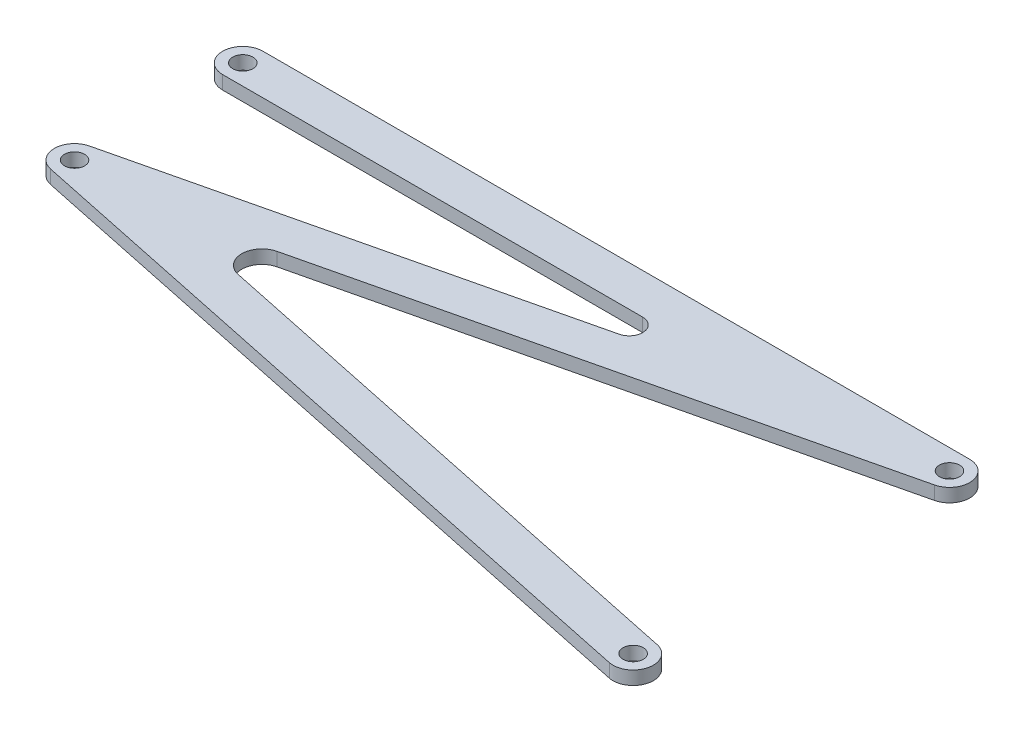
ISO-10303-21;
HEADER;
FILE_DESCRIPTION(('STEP AP214'),'2;1');
FILE_NAME('part.step','',(''),(''),'','','');
FILE_SCHEMA(('AUTOMOTIVE_DESIGN { 1 0 10303 214 1 1 1 1 }'));
ENDSEC;
DATA;
#1=APPLICATION_CONTEXT('core data for automotive mechanical design processes');
#2=APPLICATION_PROTOCOL_DEFINITION('international standard','automotive_design',2000,#1);
#3=PRODUCT_CONTEXT('',#1,'mechanical');
#4=PRODUCT('Part','Part','',(#3));
#5=PRODUCT_RELATED_PRODUCT_CATEGORY('part','',(#4));
#6=PRODUCT_DEFINITION_FORMATION('','',#4);
#7=PRODUCT_DEFINITION_CONTEXT('part definition',#1,'design');
#8=PRODUCT_DEFINITION('design','',#6,#7);
#9=PRODUCT_DEFINITION_SHAPE('','',#8);
#10=(LENGTH_UNIT() NAMED_UNIT(*) SI_UNIT(.MILLI.,.METRE.));
#11=(NAMED_UNIT(*) PLANE_ANGLE_UNIT() SI_UNIT($,.RADIAN.));
#12=(NAMED_UNIT(*) SI_UNIT($,.STERADIAN.) SOLID_ANGLE_UNIT());
#13=UNCERTAINTY_MEASURE_WITH_UNIT(LENGTH_MEASURE(1.E-05),#10,'distance_accuracy_value','');
#14=(GEOMETRIC_REPRESENTATION_CONTEXT(3) GLOBAL_UNCERTAINTY_ASSIGNED_CONTEXT((#13)) GLOBAL_UNIT_ASSIGNED_CONTEXT((#10,
#11,#12)) REPRESENTATION_CONTEXT('',''));
#15=CARTESIAN_POINT('',(0.,0.,0.));
#16=DIRECTION('',(0.,0.,1.));
#17=DIRECTION('',(1.,0.,0.));
#18=AXIS2_PLACEMENT_3D('',#15,#16,#17);
#19=CARTESIAN_POINT('',(0.,10.,0.));
#20=DIRECTION('',(0.,1.,0.));
#21=DIRECTION('',(0.,0.,1.));
#22=AXIS2_PLACEMENT_3D('',#19,#20,#21);
#23=PLANE('',#22);
#24=CARTESIAN_POINT('',(-525.,10.,0.));
#25=DIRECTION('',(0.,1.,0.));
#26=DIRECTION('',(0.,0.,1.));
#27=AXIS2_PLACEMENT_3D('',#24,#25,#26);
#28=CIRCLE('',#27,7.5);
#29=CARTESIAN_POINT('',(-525.,10.,7.5));
#30=VERTEX_POINT('',#29);
#31=EDGE_CURVE('E175',#30,#30,#28,.F.);
#32=ORIENTED_EDGE('',*,*,#31,.T.);
#33=EDGE_LOOP('',(#32));
#34=FACE_BOUND('',#33,.T.);
#35=CARTESIAN_POINT('',(-525.,10.,125.));
#36=DIRECTION('',(0.,1.,0.));
#37=DIRECTION('',(0.,0.,1.));
#38=AXIS2_PLACEMENT_3D('',#35,#36,#37);
#39=CIRCLE('',#38,7.5);
#40=CARTESIAN_POINT('',(-525.,10.,132.5));
#41=VERTEX_POINT('',#40);
#42=EDGE_CURVE('E178',#41,#41,#39,.F.);
#43=ORIENTED_EDGE('',*,*,#42,.T.);
#44=EDGE_LOOP('',(#43));
#45=FACE_BOUND('',#44,.T.);
#46=CARTESIAN_POINT('',(0.,10.,235.));
#47=DIRECTION('',(0.,1.,0.));
#48=DIRECTION('',(0.,0.,1.));
#49=AXIS2_PLACEMENT_3D('',#46,#47,#48);
#50=CIRCLE('',#49,7.5);
#51=CARTESIAN_POINT('',(0.,10.,242.5));
#52=VERTEX_POINT('',#51);
#53=EDGE_CURVE('E181',#52,#52,#50,.F.);
#54=ORIENTED_EDGE('',*,*,#53,.T.);
#55=EDGE_LOOP('',(#54));
#56=FACE_BOUND('',#55,.T.);
#57=CARTESIAN_POINT('',(0.,10.,0.));
#58=DIRECTION('',(0.,1.,0.));
#59=DIRECTION('',(0.,0.,1.));
#60=AXIS2_PLACEMENT_3D('',#57,#58,#59);
#61=CIRCLE('',#60,7.5);
#62=CARTESIAN_POINT('',(0.,10.,7.5));
#63=VERTEX_POINT('',#62);
#64=EDGE_CURVE('E184',#63,#63,#61,.F.);
#65=ORIENTED_EDGE('',*,*,#64,.T.);
#66=EDGE_LOOP('',(#65));
#67=FACE_BOUND('',#66,.T.);
#68=DIRECTION('',(-1.,0.,0.));
#69=VECTOR('',#68,1.);
#70=CARTESIAN_POINT('',(0.,10.,-15.));
#71=LINE('',#70,#69);
#72=CARTESIAN_POINT('',(-525.,10.,-15.));
#73=VERTEX_POINT('',#72);
#74=CARTESIAN_POINT('',(0.,10.,-15.));
#75=VERTEX_POINT('',#74);
#76=EDGE_CURVE('E116',#73,#75,#71,.F.);
#77=ORIENTED_EDGE('',*,*,#76,.F.);
#78=CARTESIAN_POINT('',(-525.,10.,0.));
#79=DIRECTION('',(0.,1.,0.));
#80=DIRECTION('',(0.,0.,1.));
#81=AXIS2_PLACEMENT_3D('',#78,#79,#80);
#82=CIRCLE('',#81,15.);
#83=CARTESIAN_POINT('',(-525.,10.,15.));
#84=VERTEX_POINT('',#83);
#85=EDGE_CURVE('E19',#84,#73,#82,.F.);
#86=ORIENTED_EDGE('',*,*,#85,.F.);
#87=DIRECTION('',(1.,0.,0.));
#88=VECTOR('',#87,1.);
#89=CARTESIAN_POINT('',(-525.,10.,15.));
#90=LINE('',#89,#88);
#91=CARTESIAN_POINT('',(-212.9351657246,10.,15.));
#92=VERTEX_POINT('',#91);
#93=EDGE_CURVE('E101',#92,#84,#90,.F.);
#94=ORIENTED_EDGE('',*,*,#93,.F.);
#95=CARTESIAN_POINT('',(-212.9351657246,10.,25.));
#96=DIRECTION('',(0.,1.,0.));
#97=DIRECTION('',(0.,0.,1.));
#98=AXIS2_PLACEMENT_3D('',#95,#96,#97);
#99=CIRCLE('',#98,10.);
#100=CARTESIAN_POINT('',(-210.618960451572,10.,34.7280621468433));
#101=VERTEX_POINT('',#100);
#102=EDGE_CURVE('E124',#92,#101,#99,.F.);
#103=ORIENTED_EDGE('',*,*,#102,.T.);
#104=DIRECTION('',(-0.972806214685378,0.,0.231620527305995));
#105=VECTOR('',#104,1.);
#106=CARTESIAN_POINT('',(-210.6189604516,10.,34.72806214685));
#107=LINE('',#106,#105);
#108=CARTESIAN_POINT('',(-528.474307909596,10.,110.407906779706));
#109=VERTEX_POINT('',#108);
#110=EDGE_CURVE('E142',#109,#101,#107,.F.);
#111=ORIENTED_EDGE('',*,*,#110,.F.);
#112=CARTESIAN_POINT('',(-525.,10.,125.));
#113=DIRECTION('',(0.,1.,0.));
#114=DIRECTION('',(0.,0.,1.));
#115=AXIS2_PLACEMENT_3D('',#112,#113,#114);
#116=CIRCLE('',#115,15.);
#117=CARTESIAN_POINT('',(-528.076062426002,10.,139.6812070332));
#118=VERTEX_POINT('',#117);
#119=EDGE_CURVE('E195',#118,#109,#116,.F.);
#120=ORIENTED_EDGE('',*,*,#119,.F.);
#121=DIRECTION('',(0.978747135545896,0.,0.205070828400099));
#122=VECTOR('',#121,1.);
#123=CARTESIAN_POINT('',(-528.076062426,10.,139.6812070332));
#124=LINE('',#123,#122);
#125=CARTESIAN_POINT('',(-3.07606242600158,10.,249.681207033196));
#126=VERTEX_POINT('',#125);
#127=EDGE_CURVE('E138',#126,#118,#124,.F.);
#128=ORIENTED_EDGE('',*,*,#127,.F.);
#129=CARTESIAN_POINT('',(0.,10.,235.));
#130=DIRECTION('',(0.,1.,0.));
#131=DIRECTION('',(0.,0.,1.));
#132=AXIS2_PLACEMENT_3D('',#129,#130,#131);
#133=CIRCLE('',#132,15.);
#134=CARTESIAN_POINT('',(3.07606242600239,10.,220.3187929668));
#135=VERTEX_POINT('',#134);
#136=EDGE_CURVE('E193',#135,#126,#133,.F.);
#137=ORIENTED_EDGE('',*,*,#136,.F.);
#138=DIRECTION('',(-0.978747135545896,0.,-0.205070828400099));
#139=VECTOR('',#138,1.);
#140=CARTESIAN_POINT('',(3.076062426001,10.,220.3187929668));
#141=LINE('',#140,#139);
#142=CARTESIAN_POINT('',(-390.704675288702,10.,137.812352683702));
#143=VERTEX_POINT('',#142);
#144=EDGE_CURVE('E134',#143,#135,#141,.F.);
#145=ORIENTED_EDGE('',*,*,#144,.F.);
#146=CARTESIAN_POINT('',(-387.6286128627,10.,123.1311456505));
#147=DIRECTION('',(0.,1.,0.));
#148=DIRECTION('',(0.,0.,1.));
#149=AXIS2_PLACEMENT_3D('',#146,#147,#148);
#150=CIRCLE('',#149,15.);
#151=CARTESIAN_POINT('',(-391.102920772286,10.,108.539052430297));
#152=VERTEX_POINT('',#151);
#153=EDGE_CURVE('E133',#143,#152,#150,.F.);
#154=ORIENTED_EDGE('',*,*,#153,.T.);
#155=DIRECTION('',(0.972806214685378,0.,-0.231620527305995));
#156=VECTOR('',#155,1.);
#157=CARTESIAN_POINT('',(-391.1029207723,10.,108.5390524303));
#158=LINE('',#157,#156);
#159=CARTESIAN_POINT('',(3.47430790959781,10.,14.5920932203112));
#160=VERTEX_POINT('',#159);
#161=EDGE_CURVE('E130',#160,#152,#158,.F.);
#162=ORIENTED_EDGE('',*,*,#161,.F.);
#163=CARTESIAN_POINT('',(0.,10.,0.));
#164=DIRECTION('',(0.,1.,0.));
#165=DIRECTION('',(0.,0.,1.));
#166=AXIS2_PLACEMENT_3D('',#163,#164,#165);
#167=CIRCLE('',#166,15.);
#168=EDGE_CURVE('E187',#75,#160,#167,.F.);
#169=ORIENTED_EDGE('',*,*,#168,.F.);
#170=EDGE_LOOP('',(#77,#86,#94,#103,#111,#120,#128,#137,#145,#154,#162,#169));
#171=FACE_BOUND('',#170,.T.);
#172=ADVANCED_FACE('F16',(#34,#45,#56,#67,#171),#23,.T.);
#173=CARTESIAN_POINT('',(-525.,0.,0.));
#174=DIRECTION('',(0.,1.,0.));
#175=DIRECTION('',(0.,0.,1.));
#176=AXIS2_PLACEMENT_3D('',#173,#174,#175);
#177=CYLINDRICAL_SURFACE('',#176,15.);
#178=DIRECTION('',(0.,1.,0.));
#179=VECTOR('',#178,1.);
#180=CARTESIAN_POINT('',(-525.,0.,-15.));
#181=LINE('',#180,#179);
#182=CARTESIAN_POINT('',(-525.,0.,-15.));
#183=VERTEX_POINT('',#182);
#184=EDGE_CURVE('E129',#183,#73,#181,.T.);
#185=ORIENTED_EDGE('',*,*,#184,.F.);
#186=CARTESIAN_POINT('',(-525.,0.,0.));
#187=DIRECTION('',(0.,1.,0.));
#188=DIRECTION('',(0.,0.,1.));
#189=AXIS2_PLACEMENT_3D('',#186,#187,#188);
#190=CIRCLE('',#189,15.);
#191=CARTESIAN_POINT('',(-525.,0.,15.));
#192=VERTEX_POINT('',#191);
#193=EDGE_CURVE('E122',#183,#192,#190,.T.);
#194=ORIENTED_EDGE('',*,*,#193,.T.);
#195=DIRECTION('',(0.,1.,0.));
#196=VECTOR('',#195,1.);
#197=CARTESIAN_POINT('',(-525.,0.,15.));
#198=LINE('',#197,#196);
#199=EDGE_CURVE('E106',#84,#192,#198,.F.);
#200=ORIENTED_EDGE('',*,*,#199,.F.);
#201=ORIENTED_EDGE('',*,*,#85,.T.);
#202=EDGE_LOOP('',(#185,#194,#200,#201));
#203=FACE_BOUND('',#202,.T.);
#204=ADVANCED_FACE('F121',(#203),#177,.T.);
#205=CARTESIAN_POINT('',(-525.,0.,15.));
#206=DIRECTION('',(0.,0.,1.));
#207=DIRECTION('',(1.,0.,0.));
#208=AXIS2_PLACEMENT_3D('',#205,#206,#207);
#209=PLANE('',#208);
#210=ORIENTED_EDGE('',*,*,#199,.T.);
#211=DIRECTION('',(1.,0.,0.));
#212=VECTOR('',#211,1.);
#213=CARTESIAN_POINT('',(0.,0.,15.));
#214=LINE('',#213,#212);
#215=CARTESIAN_POINT('',(-212.9351657246,0.,15.));
#216=VERTEX_POINT('',#215);
#217=EDGE_CURVE('E173',#192,#216,#214,.T.);
#218=ORIENTED_EDGE('',*,*,#217,.T.);
#219=DIRECTION('',(0.,1.,0.));
#220=VECTOR('',#219,1.);
#221=CARTESIAN_POINT('',(-212.9351657246,0.,15.));
#222=LINE('',#221,#220);
#223=EDGE_CURVE('E108',#216,#92,#222,.T.);
#224=ORIENTED_EDGE('',*,*,#223,.T.);
#225=ORIENTED_EDGE('',*,*,#93,.T.);
#226=EDGE_LOOP('',(#210,#218,#224,#225));
#227=FACE_BOUND('',#226,.T.);
#228=ADVANCED_FACE('F103',(#227),#209,.T.);
#229=CARTESIAN_POINT('',(-212.9351657246,0.,25.));
#230=DIRECTION('',(0.,1.,0.));
#231=DIRECTION('',(0.,0.,1.));
#232=AXIS2_PLACEMENT_3D('',#229,#230,#231);
#233=CYLINDRICAL_SURFACE('',#232,10.);
#234=ORIENTED_EDGE('',*,*,#102,.F.);
#235=ORIENTED_EDGE('',*,*,#223,.F.);
#236=CARTESIAN_POINT('',(-212.9351657246,0.,25.));
#237=DIRECTION('',(0.,1.,0.));
#238=DIRECTION('',(0.,0.,1.));
#239=AXIS2_PLACEMENT_3D('',#236,#237,#238);
#240=CIRCLE('',#239,10.);
#241=CARTESIAN_POINT('',(-210.618960451572,0.,34.7280621468433));
#242=VERTEX_POINT('',#241);
#243=EDGE_CURVE('E170',#216,#242,#240,.F.);
#244=ORIENTED_EDGE('',*,*,#243,.T.);
#245=DIRECTION('',(0.,1.,0.));
#246=VECTOR('',#245,1.);
#247=CARTESIAN_POINT('',(-210.6189604516,0.,34.72806214685));
#248=LINE('',#247,#246);
#249=EDGE_CURVE('E143',#101,#242,#248,.F.);
#250=ORIENTED_EDGE('',*,*,#249,.F.);
#251=EDGE_LOOP('',(#234,#235,#244,#250));
#252=FACE_BOUND('',#251,.T.);
#253=ADVANCED_FACE('F201',(#252),#233,.F.);
#254=CARTESIAN_POINT('',(-210.6189604516,0.,34.72806214685));
#255=DIRECTION('',(-0.231620527305995,0.,-0.972806214685378));
#256=DIRECTION('',(-0.972806214685378,0.,0.231620527305995));
#257=AXIS2_PLACEMENT_3D('',#254,#255,#256);
#258=PLANE('',#257);
#259=ORIENTED_EDGE('',*,*,#249,.T.);
#260=DIRECTION('',(-0.972806214685372,0.,0.231620527306019));
#261=VECTOR('',#260,1.);
#262=CARTESIAN_POINT('',(-210.6189604516,0.,34.72806214685));
#263=LINE('',#262,#261);
#264=CARTESIAN_POINT('',(-528.474307909595,0.,110.40790677971));
#265=VERTEX_POINT('',#264);
#266=EDGE_CURVE('E169',#242,#265,#263,.T.);
#267=ORIENTED_EDGE('',*,*,#266,.T.);
#268=DIRECTION('',(0.,1.,0.));
#269=VECTOR('',#268,1.);
#270=CARTESIAN_POINT('',(-528.474307909595,0.,110.407906779721));
#271=LINE('',#270,#269);
#272=EDGE_CURVE('E141',#109,#265,#271,.F.);
#273=ORIENTED_EDGE('',*,*,#272,.F.);
#274=ORIENTED_EDGE('',*,*,#110,.T.);
#275=EDGE_LOOP('',(#259,#267,#273,#274));
#276=FACE_BOUND('',#275,.T.);
#277=ADVANCED_FACE('F258',(#276),#258,.T.);
#278=CARTESIAN_POINT('',(-525.,0.,125.));
#279=DIRECTION('',(0.,1.,0.));
#280=DIRECTION('',(0.,0.,1.));
#281=AXIS2_PLACEMENT_3D('',#278,#279,#280);
#282=CYLINDRICAL_SURFACE('',#281,15.);
#283=ORIENTED_EDGE('',*,*,#272,.T.);
#284=CARTESIAN_POINT('',(-525.,0.,125.));
#285=DIRECTION('',(0.,1.,0.));
#286=DIRECTION('',(0.,0.,1.));
#287=AXIS2_PLACEMENT_3D('',#284,#285,#286);
#288=CIRCLE('',#287,15.);
#289=CARTESIAN_POINT('',(-528.076062426002,0.,139.6812070332));
#290=VERTEX_POINT('',#289);
#291=EDGE_CURVE('E166',#265,#290,#288,.T.);
#292=ORIENTED_EDGE('',*,*,#291,.T.);
#293=DIRECTION('',(0.,1.,0.));
#294=VECTOR('',#293,1.);
#295=CARTESIAN_POINT('',(-528.076062426,0.,139.6812070332));
#296=LINE('',#295,#294);
#297=EDGE_CURVE('E140',#118,#290,#296,.F.);
#298=ORIENTED_EDGE('',*,*,#297,.F.);
#299=ORIENTED_EDGE('',*,*,#119,.T.);
#300=EDGE_LOOP('',(#283,#292,#298,#299));
#301=FACE_BOUND('',#300,.T.);
#302=ADVANCED_FACE('F257',(#301),#282,.T.);
#303=CARTESIAN_POINT('',(-528.076062426,0.,139.6812070332));
#304=DIRECTION('',(-0.205070828400099,0.,0.978747135545896));
#305=DIRECTION('',(0.978747135545896,0.,0.205070828400099));
#306=AXIS2_PLACEMENT_3D('',#303,#304,#305);
#307=PLANE('',#306);
#308=ORIENTED_EDGE('',*,*,#297,.T.);
#309=DIRECTION('',(0.978747135545898,0.,0.205070828400093));
#310=VECTOR('',#309,1.);
#311=CARTESIAN_POINT('',(-528.076062426,0.,139.6812070332));
#312=LINE('',#311,#310);
#313=CARTESIAN_POINT('',(-3.0760624260012,0.,249.681207033194));
#314=VERTEX_POINT('',#313);
#315=EDGE_CURVE('E165',#290,#314,#312,.T.);
#316=ORIENTED_EDGE('',*,*,#315,.T.);
#317=DIRECTION('',(0.,1.,0.));
#318=VECTOR('',#317,1.);
#319=CARTESIAN_POINT('',(-3.07606242599871,0.,249.681207033189));
#320=LINE('',#319,#318);
#321=EDGE_CURVE('E137',#126,#314,#320,.F.);
#322=ORIENTED_EDGE('',*,*,#321,.F.);
#323=ORIENTED_EDGE('',*,*,#127,.T.);
#324=EDGE_LOOP('',(#308,#316,#322,#323));
#325=FACE_BOUND('',#324,.T.);
#326=ADVANCED_FACE('F253',(#325),#307,.T.);
#327=CARTESIAN_POINT('',(0.,0.,235.));
#328=DIRECTION('',(0.,1.,0.));
#329=DIRECTION('',(0.,0.,1.));
#330=AXIS2_PLACEMENT_3D('',#327,#328,#329);
#331=CYLINDRICAL_SURFACE('',#330,15.);
#332=ORIENTED_EDGE('',*,*,#321,.T.);
#333=CARTESIAN_POINT('',(0.,0.,235.));
#334=DIRECTION('',(0.,1.,0.));
#335=DIRECTION('',(0.,0.,1.));
#336=AXIS2_PLACEMENT_3D('',#333,#334,#335);
#337=CIRCLE('',#336,15.);
#338=CARTESIAN_POINT('',(3.0760624260027,0.,220.3187929668));
#339=VERTEX_POINT('',#338);
#340=EDGE_CURVE('E162',#314,#339,#337,.T.);
#341=ORIENTED_EDGE('',*,*,#340,.T.);
#342=DIRECTION('',(0.,1.,0.));
#343=VECTOR('',#342,1.);
#344=CARTESIAN_POINT('',(3.076062426001,0.,220.3187929668));
#345=LINE('',#344,#343);
#346=EDGE_CURVE('E136',#135,#339,#345,.F.);
#347=ORIENTED_EDGE('',*,*,#346,.F.);
#348=ORIENTED_EDGE('',*,*,#136,.T.);
#349=EDGE_LOOP('',(#332,#341,#347,#348));
#350=FACE_BOUND('',#349,.T.);
#351=ADVANCED_FACE('F249',(#350),#331,.T.);
#352=CARTESIAN_POINT('',(3.076062426001,0.,220.3187929668));
#353=DIRECTION('',(0.205070828400099,0.,-0.978747135545896));
#354=DIRECTION('',(-0.978747135545896,0.,-0.205070828400099));
#355=AXIS2_PLACEMENT_3D('',#352,#353,#354);
#356=PLANE('',#355);
#357=ORIENTED_EDGE('',*,*,#346,.T.);
#358=DIRECTION('',(-0.978747135545888,0.,-0.20507082840014));
#359=VECTOR('',#358,1.);
#360=CARTESIAN_POINT('',(3.076062426001,0.,220.3187929668));
#361=LINE('',#360,#359);
#362=CARTESIAN_POINT('',(-390.704675288701,0.,137.812352683694));
#363=VERTEX_POINT('',#362);
#364=EDGE_CURVE('E161',#339,#363,#361,.T.);
#365=ORIENTED_EDGE('',*,*,#364,.T.);
#366=DIRECTION('',(0.,1.,0.));
#367=VECTOR('',#366,1.);
#368=CARTESIAN_POINT('',(-390.704675288698,0.,137.812352683689));
#369=LINE('',#368,#367);
#370=EDGE_CURVE('E192',#363,#143,#369,.T.);
#371=ORIENTED_EDGE('',*,*,#370,.T.);
#372=ORIENTED_EDGE('',*,*,#144,.T.);
#373=EDGE_LOOP('',(#357,#365,#371,#372));
#374=FACE_BOUND('',#373,.T.);
#375=ADVANCED_FACE('F243',(#374),#356,.T.);
#376=CARTESIAN_POINT('',(-387.6286128627,0.,123.1311456505));
#377=DIRECTION('',(0.,1.,0.));
#378=DIRECTION('',(0.,0.,1.));
#379=AXIS2_PLACEMENT_3D('',#376,#377,#378);
#380=CYLINDRICAL_SURFACE('',#379,15.);
#381=ORIENTED_EDGE('',*,*,#153,.F.);
#382=ORIENTED_EDGE('',*,*,#370,.F.);
#383=CARTESIAN_POINT('',(-387.6286128627,0.,123.1311456505));
#384=DIRECTION('',(0.,1.,0.));
#385=DIRECTION('',(0.,0.,1.));
#386=AXIS2_PLACEMENT_3D('',#383,#384,#385);
#387=CIRCLE('',#386,15.);
#388=CARTESIAN_POINT('',(-391.102920772287,0.,108.539052430297));
#389=VERTEX_POINT('',#388);
#390=EDGE_CURVE('E158',#363,#389,#387,.F.);
#391=ORIENTED_EDGE('',*,*,#390,.T.);
#392=DIRECTION('',(0.,1.,0.));
#393=VECTOR('',#392,1.);
#394=CARTESIAN_POINT('',(-391.1029207723,0.,108.5390524303));
#395=LINE('',#394,#393);
#396=EDGE_CURVE('E132',#152,#389,#395,.F.);
#397=ORIENTED_EDGE('',*,*,#396,.F.);
#398=EDGE_LOOP('',(#381,#382,#391,#397));
#399=FACE_BOUND('',#398,.T.);
#400=ADVANCED_FACE('F241',(#399),#380,.F.);
#401=CARTESIAN_POINT('',(-391.1029207723,0.,108.5390524303));
#402=DIRECTION('',(0.231620527305995,0.,0.972806214685378));
#403=DIRECTION('',(0.972806214685378,0.,-0.231620527305995));
#404=AXIS2_PLACEMENT_3D('',#401,#402,#403);
#405=PLANE('',#404);
#406=ORIENTED_EDGE('',*,*,#396,.T.);
#407=DIRECTION('',(0.972806214685341,0.,-0.231620527306147));
#408=VECTOR('',#407,1.);
#409=CARTESIAN_POINT('',(-391.1029207723,0.,108.5390524303));
#410=LINE('',#409,#408);
#411=CARTESIAN_POINT('',(3.4743079095916,0.,14.5920932202801));
#412=VERTEX_POINT('',#411);
#413=EDGE_CURVE('E157',#389,#412,#410,.T.);
#414=ORIENTED_EDGE('',*,*,#413,.T.);
#415=DIRECTION('',(0.,1.,0.));
#416=VECTOR('',#415,1.);
#417=CARTESIAN_POINT('',(3.47430790959109,0.,14.5920932202804));
#418=LINE('',#417,#416);
#419=EDGE_CURVE('E189',#160,#412,#418,.F.);
#420=ORIENTED_EDGE('',*,*,#419,.F.);
#421=ORIENTED_EDGE('',*,*,#161,.T.);
#422=EDGE_LOOP('',(#406,#414,#420,#421));
#423=FACE_BOUND('',#422,.T.);
#424=ADVANCED_FACE('F235',(#423),#405,.T.);
#425=CARTESIAN_POINT('',(0.,0.,0.));
#426=DIRECTION('',(0.,1.,0.));
#427=DIRECTION('',(0.,0.,1.));
#428=AXIS2_PLACEMENT_3D('',#425,#426,#427);
#429=CYLINDRICAL_SURFACE('',#428,15.);
#430=ORIENTED_EDGE('',*,*,#419,.T.);
#431=CARTESIAN_POINT('',(0.,0.,0.));
#432=DIRECTION('',(0.,1.,0.));
#433=DIRECTION('',(0.,0.,1.));
#434=AXIS2_PLACEMENT_3D('',#431,#432,#433);
#435=CIRCLE('',#434,15.);
#436=CARTESIAN_POINT('',(0.,0.,-15.));
#437=VERTEX_POINT('',#436);
#438=EDGE_CURVE('E154',#412,#437,#435,.T.);
#439=ORIENTED_EDGE('',*,*,#438,.T.);
#440=DIRECTION('',(0.,1.,0.));
#441=VECTOR('',#440,1.);
#442=CARTESIAN_POINT('',(0.,0.,-15.));
#443=LINE('',#442,#441);
#444=EDGE_CURVE('E34',#75,#437,#443,.F.);
#445=ORIENTED_EDGE('',*,*,#444,.F.);
#446=ORIENTED_EDGE('',*,*,#168,.T.);
#447=EDGE_LOOP('',(#430,#439,#445,#446));
#448=FACE_BOUND('',#447,.T.);
#449=ADVANCED_FACE('F231',(#448),#429,.T.);
#450=CARTESIAN_POINT('',(0.,0.,-15.));
#451=DIRECTION('',(0.,0.,-1.));
#452=DIRECTION('',(-1.,0.,0.));
#453=AXIS2_PLACEMENT_3D('',#450,#451,#452);
#454=PLANE('',#453);
#455=ORIENTED_EDGE('',*,*,#444,.T.);
#456=DIRECTION('',(1.,0.,0.));
#457=VECTOR('',#456,1.);
#458=CARTESIAN_POINT('',(0.,0.,-15.));
#459=LINE('',#458,#457);
#460=EDGE_CURVE('E153',#437,#183,#459,.F.);
#461=ORIENTED_EDGE('',*,*,#460,.T.);
#462=ORIENTED_EDGE('',*,*,#184,.T.);
#463=ORIENTED_EDGE('',*,*,#76,.T.);
#464=EDGE_LOOP('',(#455,#461,#462,#463));
#465=FACE_BOUND('',#464,.T.);
#466=ADVANCED_FACE('F225',(#465),#454,.T.);
#467=CARTESIAN_POINT('',(0.,0.,0.));
#468=DIRECTION('',(0.,1.,0.));
#469=DIRECTION('',(0.,0.,1.));
#470=AXIS2_PLACEMENT_3D('',#467,#468,#469);
#471=CYLINDRICAL_SURFACE('',#470,7.5);
#472=ORIENTED_EDGE('',*,*,#64,.F.);
#473=EDGE_LOOP('',(#472));
#474=FACE_BOUND('',#473,.T.);
#475=CARTESIAN_POINT('',(0.,0.,0.));
#476=DIRECTION('',(0.,1.,0.));
#477=DIRECTION('',(0.,0.,1.));
#478=AXIS2_PLACEMENT_3D('',#475,#476,#477);
#479=CIRCLE('',#478,7.5);
#480=CARTESIAN_POINT('',(0.,0.,7.5));
#481=VERTEX_POINT('',#480);
#482=EDGE_CURVE('E150',#481,#481,#479,.F.);
#483=ORIENTED_EDGE('',*,*,#482,.T.);
#484=EDGE_LOOP('',(#483));
#485=FACE_BOUND('',#484,.T.);
#486=ADVANCED_FACE('F287',(#474,#485),#471,.F.);
#487=CARTESIAN_POINT('',(0.,0.,235.));
#488=DIRECTION('',(0.,1.,0.));
#489=DIRECTION('',(0.,0.,1.));
#490=AXIS2_PLACEMENT_3D('',#487,#488,#489);
#491=CYLINDRICAL_SURFACE('',#490,7.5);
#492=ORIENTED_EDGE('',*,*,#53,.F.);
#493=EDGE_LOOP('',(#492));
#494=FACE_BOUND('',#493,.T.);
#495=CARTESIAN_POINT('',(0.,0.,235.));
#496=DIRECTION('',(0.,1.,0.));
#497=DIRECTION('',(0.,0.,1.));
#498=AXIS2_PLACEMENT_3D('',#495,#496,#497);
#499=CIRCLE('',#498,7.5);
#500=CARTESIAN_POINT('',(0.,0.,242.5));
#501=VERTEX_POINT('',#500);
#502=EDGE_CURVE('E147',#501,#501,#499,.F.);
#503=ORIENTED_EDGE('',*,*,#502,.T.);
#504=EDGE_LOOP('',(#503));
#505=FACE_BOUND('',#504,.T.);
#506=ADVANCED_FACE('F283',(#494,#505),#491,.F.);
#507=CARTESIAN_POINT('',(-525.,0.,125.));
#508=DIRECTION('',(0.,1.,0.));
#509=DIRECTION('',(0.,0.,1.));
#510=AXIS2_PLACEMENT_3D('',#507,#508,#509);
#511=CYLINDRICAL_SURFACE('',#510,7.5);
#512=ORIENTED_EDGE('',*,*,#42,.F.);
#513=EDGE_LOOP('',(#512));
#514=FACE_BOUND('',#513,.T.);
#515=CARTESIAN_POINT('',(-525.,0.,125.));
#516=DIRECTION('',(0.,1.,0.));
#517=DIRECTION('',(0.,0.,1.));
#518=AXIS2_PLACEMENT_3D('',#515,#516,#517);
#519=CIRCLE('',#518,7.5);
#520=CARTESIAN_POINT('',(-525.,0.,132.5));
#521=VERTEX_POINT('',#520);
#522=EDGE_CURVE('E25',#521,#521,#519,.F.);
#523=ORIENTED_EDGE('',*,*,#522,.T.);
#524=EDGE_LOOP('',(#523));
#525=FACE_BOUND('',#524,.T.);
#526=ADVANCED_FACE('F275',(#514,#525),#511,.F.);
#527=CARTESIAN_POINT('',(-525.,0.,0.));
#528=DIRECTION('',(0.,1.,0.));
#529=DIRECTION('',(0.,0.,1.));
#530=AXIS2_PLACEMENT_3D('',#527,#528,#529);
#531=CYLINDRICAL_SURFACE('',#530,7.5);
#532=ORIENTED_EDGE('',*,*,#31,.F.);
#533=EDGE_LOOP('',(#532));
#534=FACE_BOUND('',#533,.T.);
#535=CARTESIAN_POINT('',(-525.,0.,0.));
#536=DIRECTION('',(0.,1.,0.));
#537=DIRECTION('',(0.,0.,1.));
#538=AXIS2_PLACEMENT_3D('',#535,#536,#537);
#539=CIRCLE('',#538,7.5);
#540=CARTESIAN_POINT('',(-525.,0.,7.5));
#541=VERTEX_POINT('',#540);
#542=EDGE_CURVE('E10',#541,#541,#539,.F.);
#543=ORIENTED_EDGE('',*,*,#542,.T.);
#544=EDGE_LOOP('',(#543));
#545=FACE_BOUND('',#544,.T.);
#546=ADVANCED_FACE('F269',(#534,#545),#531,.F.);
#547=CARTESIAN_POINT('',(0.,0.,0.));
#548=DIRECTION('',(0.,1.,0.));
#549=DIRECTION('',(0.,0.,1.));
#550=AXIS2_PLACEMENT_3D('',#547,#548,#549);
#551=PLANE('',#550);
#552=ORIENTED_EDGE('',*,*,#542,.F.);
#553=EDGE_LOOP('',(#552));
#554=FACE_BOUND('',#553,.T.);
#555=ORIENTED_EDGE('',*,*,#522,.F.);
#556=EDGE_LOOP('',(#555));
#557=FACE_BOUND('',#556,.T.);
#558=ORIENTED_EDGE('',*,*,#502,.F.);
#559=EDGE_LOOP('',(#558));
#560=FACE_BOUND('',#559,.T.);
#561=ORIENTED_EDGE('',*,*,#482,.F.);
#562=EDGE_LOOP('',(#561));
#563=FACE_BOUND('',#562,.T.);
#564=ORIENTED_EDGE('',*,*,#438,.F.);
#565=ORIENTED_EDGE('',*,*,#413,.F.);
#566=ORIENTED_EDGE('',*,*,#390,.F.);
#567=ORIENTED_EDGE('',*,*,#364,.F.);
#568=ORIENTED_EDGE('',*,*,#340,.F.);
#569=ORIENTED_EDGE('',*,*,#315,.F.);
#570=ORIENTED_EDGE('',*,*,#291,.F.);
#571=ORIENTED_EDGE('',*,*,#266,.F.);
#572=ORIENTED_EDGE('',*,*,#243,.F.);
#573=ORIENTED_EDGE('',*,*,#217,.F.);
#574=ORIENTED_EDGE('',*,*,#193,.F.);
#575=ORIENTED_EDGE('',*,*,#460,.F.);
#576=EDGE_LOOP('',(#564,#565,#566,#567,#568,#569,#570,#571,#572,#573,#574,#575));
#577=FACE_BOUND('',#576,.T.);
#578=ADVANCED_FACE('F228',(#554,#557,#560,#563,#577),#551,.F.);
#579=CLOSED_SHELL('',(#172,#204,#228,#253,#277,#302,#326,#351,#375,#400,#424,#449,#466,#486,
#506,#526,#546,#578));
#580=MANIFOLD_SOLID_BREP('B1',#579);
#581=ADVANCED_BREP_SHAPE_REPRESENTATION('',(#18,#580),#14);
#582=SHAPE_DEFINITION_REPRESENTATION(#9,#581);
ENDSEC;
END-ISO-10303-21;
